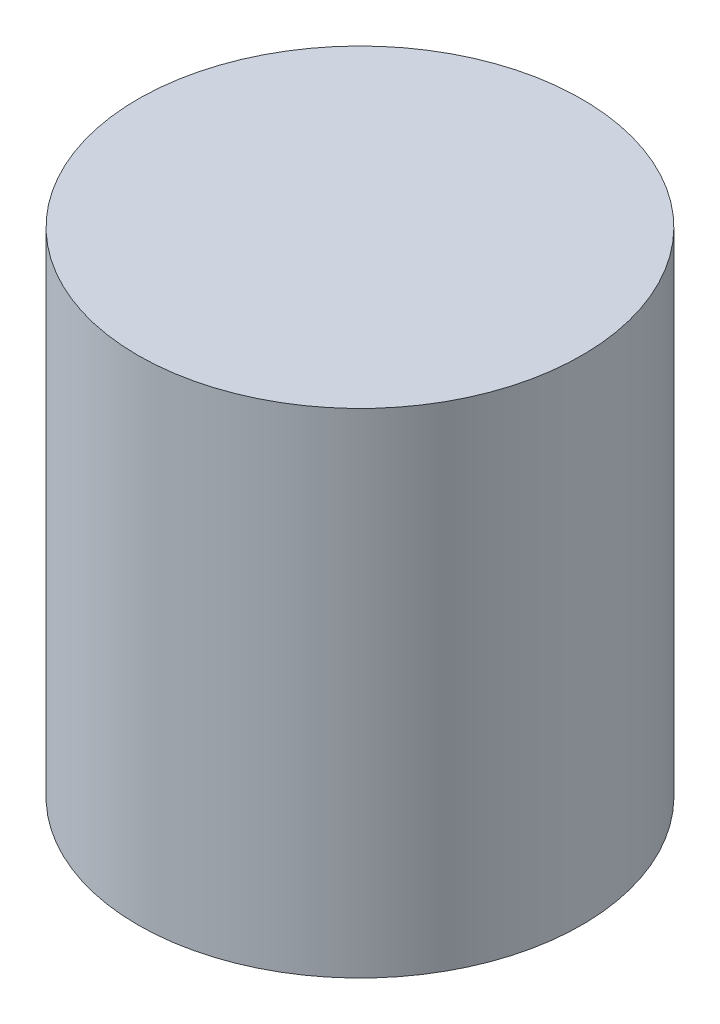
ISO-10303-21;
HEADER;
FILE_DESCRIPTION(('STEP AP214'),'2;1');
FILE_NAME('part.step','',(''),(''),'','','');
FILE_SCHEMA(('AUTOMOTIVE_DESIGN { 1 0 10303 214 1 1 1 1 }'));
ENDSEC;
DATA;
#1=APPLICATION_CONTEXT('core data for automotive mechanical design processes');
#2=APPLICATION_PROTOCOL_DEFINITION('international standard','automotive_design',2000,#1);
#3=PRODUCT_CONTEXT('',#1,'mechanical');
#4=PRODUCT('Part','Part','',(#3));
#5=PRODUCT_RELATED_PRODUCT_CATEGORY('part','',(#4));
#6=PRODUCT_DEFINITION_FORMATION('','',#4);
#7=PRODUCT_DEFINITION_CONTEXT('part definition',#1,'design');
#8=PRODUCT_DEFINITION('design','',#6,#7);
#9=PRODUCT_DEFINITION_SHAPE('','',#8);
#10=(LENGTH_UNIT() NAMED_UNIT(*) SI_UNIT(.MILLI.,.METRE.));
#11=(NAMED_UNIT(*) PLANE_ANGLE_UNIT() SI_UNIT($,.RADIAN.));
#12=(NAMED_UNIT(*) SI_UNIT($,.STERADIAN.) SOLID_ANGLE_UNIT());
#13=UNCERTAINTY_MEASURE_WITH_UNIT(LENGTH_MEASURE(1.E-05),#10,'distance_accuracy_value','');
#14=(GEOMETRIC_REPRESENTATION_CONTEXT(3) GLOBAL_UNCERTAINTY_ASSIGNED_CONTEXT((#13)) GLOBAL_UNIT_ASSIGNED_CONTEXT((#10,
#11,#12)) REPRESENTATION_CONTEXT('',''));
#15=CARTESIAN_POINT('',(0.,0.,0.));
#16=DIRECTION('',(0.,0.,1.));
#17=DIRECTION('',(1.,0.,0.));
#18=AXIS2_PLACEMENT_3D('',#15,#16,#17);
#19=CARTESIAN_POINT('',(0.,200.,0.));
#20=DIRECTION('',(0.,-1.,0.));
#21=DIRECTION('',(0.,0.,-1.));
#22=AXIS2_PLACEMENT_3D('',#19,#20,#21);
#23=CYLINDRICAL_SURFACE('',#22,90.);
#24=CARTESIAN_POINT('',(0.,200.,0.));
#25=DIRECTION('',(0.,1.,0.));
#26=DIRECTION('',(0.,0.,1.));
#27=AXIS2_PLACEMENT_3D('',#24,#25,#26);
#28=CIRCLE('',#27,90.);
#29=CARTESIAN_POINT('',(0.,200.,90.));
#30=VERTEX_POINT('',#29);
#31=EDGE_CURVE('E10',#30,#30,#28,.T.);
#32=ORIENTED_EDGE('',*,*,#31,.F.);
#33=EDGE_LOOP('',(#32));
#34=FACE_BOUND('',#33,.T.);
#35=CARTESIAN_POINT('',(0.,0.,0.));
#36=DIRECTION('',(0.,1.,0.));
#37=DIRECTION('',(0.,0.,1.));
#38=AXIS2_PLACEMENT_3D('',#35,#36,#37);
#39=CIRCLE('',#38,90.);
#40=CARTESIAN_POINT('',(0.,0.,90.));
#41=VERTEX_POINT('',#40);
#42=EDGE_CURVE('E38',#41,#41,#39,.T.);
#43=ORIENTED_EDGE('',*,*,#42,.T.);
#44=EDGE_LOOP('',(#43));
#45=FACE_BOUND('',#44,.T.);
#46=ADVANCED_FACE('F35',(#34,#45),#23,.T.);
#47=CARTESIAN_POINT('',(0.,200.,0.));
#48=DIRECTION('',(0.,1.,0.));
#49=DIRECTION('',(0.,0.,1.));
#50=AXIS2_PLACEMENT_3D('',#47,#48,#49);
#51=PLANE('',#50);
#52=ORIENTED_EDGE('',*,*,#31,.T.);
#53=EDGE_LOOP('',(#52));
#54=FACE_BOUND('',#53,.T.);
#55=ADVANCED_FACE('F50',(#54),#51,.T.);
#56=CARTESIAN_POINT('',(0.,0.,0.));
#57=DIRECTION('',(0.,1.,0.));
#58=DIRECTION('',(0.,0.,1.));
#59=AXIS2_PLACEMENT_3D('',#56,#57,#58);
#60=PLANE('',#59);
#61=ORIENTED_EDGE('',*,*,#42,.F.);
#62=EDGE_LOOP('',(#61));
#63=FACE_BOUND('',#62,.T.);
#64=ADVANCED_FACE('F48',(#63),#60,.F.);
#65=CLOSED_SHELL('',(#46,#55,#64));
#66=MANIFOLD_SOLID_BREP('B2',#65);
#67=ADVANCED_BREP_SHAPE_REPRESENTATION('',(#18,#66),#14);
#68=SHAPE_DEFINITION_REPRESENTATION(#9,#67);
ENDSEC;
END-ISO-10303-21;
